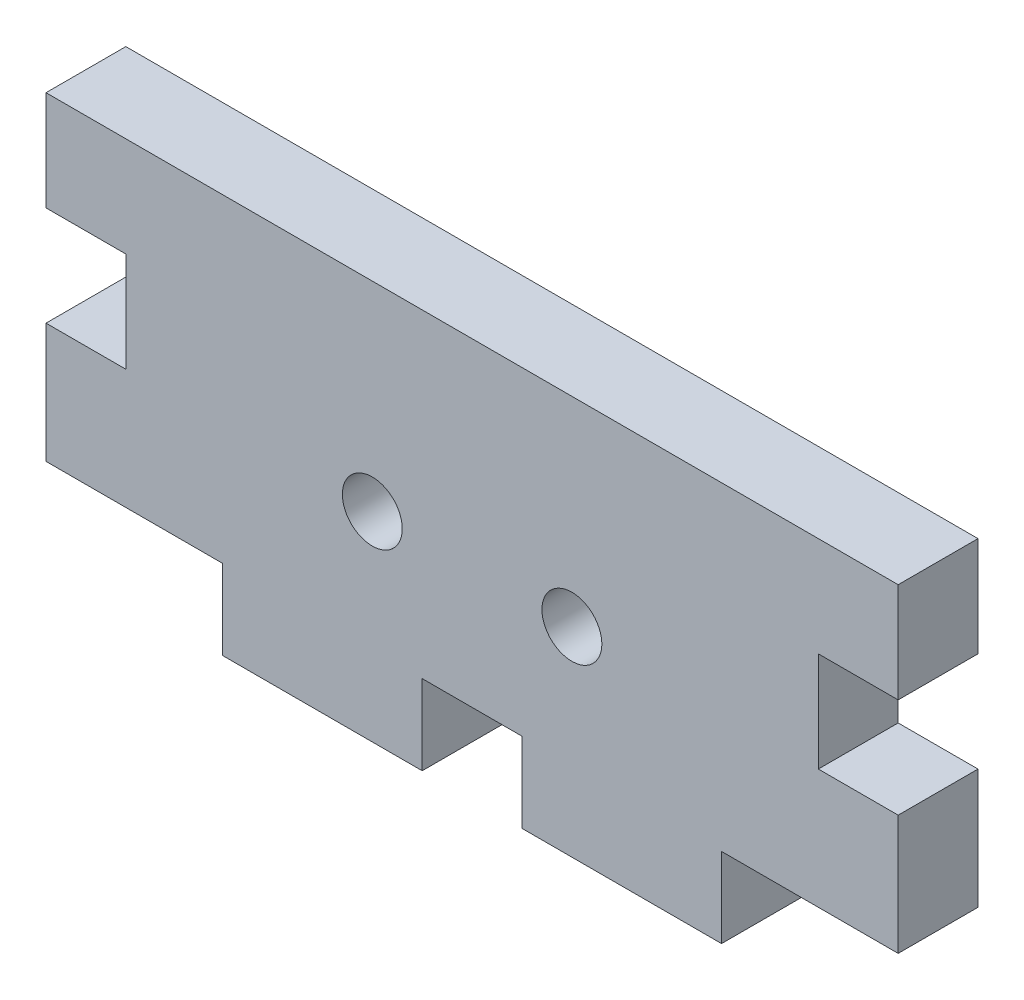
ISO-10303-21;
HEADER;
FILE_DESCRIPTION(('STEP AP214'),'2;1');
FILE_NAME('part.step','',(''),(''),'','','');
FILE_SCHEMA(('AUTOMOTIVE_DESIGN { 1 0 10303 214 1 1 1 1 }'));
ENDSEC;
DATA;
#1=APPLICATION_CONTEXT('core data for automotive mechanical design processes');
#2=APPLICATION_PROTOCOL_DEFINITION('international standard','automotive_design',2000,#1);
#3=PRODUCT_CONTEXT('',#1,'mechanical');
#4=PRODUCT('Part','Part','',(#3));
#5=PRODUCT_RELATED_PRODUCT_CATEGORY('part','',(#4));
#6=PRODUCT_DEFINITION_FORMATION('','',#4);
#7=PRODUCT_DEFINITION_CONTEXT('part definition',#1,'design');
#8=PRODUCT_DEFINITION('design','',#6,#7);
#9=PRODUCT_DEFINITION_SHAPE('','',#8);
#10=(LENGTH_UNIT() NAMED_UNIT(*) SI_UNIT(.MILLI.,.METRE.));
#11=(NAMED_UNIT(*) PLANE_ANGLE_UNIT() SI_UNIT($,.RADIAN.));
#12=(NAMED_UNIT(*) SI_UNIT($,.STERADIAN.) SOLID_ANGLE_UNIT());
#13=UNCERTAINTY_MEASURE_WITH_UNIT(LENGTH_MEASURE(1.E-05),#10,'distance_accuracy_value','');
#14=(GEOMETRIC_REPRESENTATION_CONTEXT(3) GLOBAL_UNCERTAINTY_ASSIGNED_CONTEXT((#13)) GLOBAL_UNIT_ASSIGNED_CONTEXT((#10,
#11,#12)) REPRESENTATION_CONTEXT('',''));
#15=CARTESIAN_POINT('',(0.,0.,0.));
#16=DIRECTION('',(0.,0.,1.));
#17=DIRECTION('',(1.,0.,0.));
#18=AXIS2_PLACEMENT_3D('',#15,#16,#17);
#19=CARTESIAN_POINT('',(0.,0.,4.));
#20=DIRECTION('',(1.,0.,0.));
#21=DIRECTION('',(0.,0.,-1.));
#22=AXIS2_PLACEMENT_3D('',#19,#20,#21);
#23=PLANE('',#22);
#24=DIRECTION('',(0.,-1.,0.));
#25=VECTOR('',#24,1.);
#26=CARTESIAN_POINT('',(0.,0.,0.));
#27=LINE('',#26,#25);
#28=CARTESIAN_POINT('',(0.,20.,0.));
#29=VERTEX_POINT('',#28);
#30=CARTESIAN_POINT('',(0.,15.,0.));
#31=VERTEX_POINT('',#30);
#32=EDGE_CURVE('E435',#29,#31,#27,.T.);
#33=ORIENTED_EDGE('',*,*,#32,.T.);
#34=DIRECTION('',(0.,0.,1.));
#35=VECTOR('',#34,1.);
#36=CARTESIAN_POINT('',(0.,15.,0.));
#37=LINE('',#36,#35);
#38=CARTESIAN_POINT('',(0.,15.,4.));
#39=VERTEX_POINT('',#38);
#40=EDGE_CURVE('E255',#31,#39,#37,.T.);
#41=ORIENTED_EDGE('',*,*,#40,.T.);
#42=DIRECTION('',(0.,-1.,0.));
#43=VECTOR('',#42,1.);
#44=CARTESIAN_POINT('',(0.,0.,4.));
#45=LINE('',#44,#43);
#46=CARTESIAN_POINT('',(0.,20.,4.));
#47=VERTEX_POINT('',#46);
#48=EDGE_CURVE('E285',#47,#39,#45,.T.);
#49=ORIENTED_EDGE('',*,*,#48,.F.);
#50=DIRECTION('',(0.,0.,-1.));
#51=VECTOR('',#50,1.);
#52=CARTESIAN_POINT('',(0.,20.,4.));
#53=LINE('',#52,#51);
#54=EDGE_CURVE('E51',#47,#29,#53,.T.);
#55=ORIENTED_EDGE('',*,*,#54,.T.);
#56=EDGE_LOOP('',(#33,#41,#49,#55));
#57=FACE_BOUND('',#56,.T.);
#58=ADVANCED_FACE('F42',(#57),#23,.F.);
#59=CARTESIAN_POINT('',(0.,0.,4.));
#60=DIRECTION('',(0.,1.,0.));
#61=DIRECTION('',(0.,0.,1.));
#62=AXIS2_PLACEMENT_3D('',#59,#60,#61);
#63=PLANE('',#62);
#64=DIRECTION('',(1.,0.,0.));
#65=VECTOR('',#64,1.);
#66=CARTESIAN_POINT('',(0.,0.,4.));
#67=LINE('',#66,#65);
#68=CARTESIAN_POINT('',(23.85,0.,4.));
#69=VERTEX_POINT('',#68);
#70=CARTESIAN_POINT('',(33.85,0.,4.));
#71=VERTEX_POINT('',#70);
#72=EDGE_CURVE('E270',#69,#71,#67,.T.);
#73=ORIENTED_EDGE('',*,*,#72,.F.);
#74=DIRECTION('',(0.,0.,1.));
#75=VECTOR('',#74,1.);
#76=CARTESIAN_POINT('',(23.85,0.,0.));
#77=LINE('',#76,#75);
#78=CARTESIAN_POINT('',(23.85,0.,0.));
#79=VERTEX_POINT('',#78);
#80=EDGE_CURVE('E237',#79,#69,#77,.T.);
#81=ORIENTED_EDGE('',*,*,#80,.F.);
#82=DIRECTION('',(1.,0.,0.));
#83=VECTOR('',#82,1.);
#84=CARTESIAN_POINT('',(0.,0.,0.));
#85=LINE('',#84,#83);
#86=CARTESIAN_POINT('',(33.85,0.,0.));
#87=VERTEX_POINT('',#86);
#88=EDGE_CURVE('E414',#79,#87,#85,.T.);
#89=ORIENTED_EDGE('',*,*,#88,.T.);
#90=DIRECTION('',(0.,0.,1.));
#91=VECTOR('',#90,1.);
#92=CARTESIAN_POINT('',(33.85,0.,0.));
#93=LINE('',#92,#91);
#94=EDGE_CURVE('E222',#87,#71,#93,.T.);
#95=ORIENTED_EDGE('',*,*,#94,.T.);
#96=EDGE_LOOP('',(#73,#81,#89,#95));
#97=FACE_BOUND('',#96,.T.);
#98=ADVANCED_FACE('F412',(#97),#63,.F.);
#99=CARTESIAN_POINT('',(42.7,0.,4.));
#100=DIRECTION('',(-1.,0.,0.));
#101=DIRECTION('',(0.,0.,1.));
#102=AXIS2_PLACEMENT_3D('',#99,#100,#101);
#103=PLANE('',#102);
#104=DIRECTION('',(0.,1.,0.));
#105=VECTOR('',#104,1.);
#106=CARTESIAN_POINT('',(42.7,0.,4.));
#107=LINE('',#106,#105);
#108=CARTESIAN_POINT('',(42.7,4.00000000000001,4.));
#109=VERTEX_POINT('',#108);
#110=CARTESIAN_POINT('',(42.7,10.,4.));
#111=VERTEX_POINT('',#110);
#112=EDGE_CURVE('E268',#109,#111,#107,.T.);
#113=ORIENTED_EDGE('',*,*,#112,.F.);
#114=DIRECTION('',(0.,0.,1.));
#115=VECTOR('',#114,1.);
#116=CARTESIAN_POINT('',(42.7,4.00000000000001,0.));
#117=LINE('',#116,#115);
#118=CARTESIAN_POINT('',(42.7,4.00000000000001,0.));
#119=VERTEX_POINT('',#118);
#120=EDGE_CURVE('E249',#119,#109,#117,.T.);
#121=ORIENTED_EDGE('',*,*,#120,.F.);
#122=DIRECTION('',(0.,1.,0.));
#123=VECTOR('',#122,1.);
#124=CARTESIAN_POINT('',(42.7,0.,0.));
#125=LINE('',#124,#123);
#126=CARTESIAN_POINT('',(42.7,10.,0.));
#127=VERTEX_POINT('',#126);
#128=EDGE_CURVE('E433',#119,#127,#125,.T.);
#129=ORIENTED_EDGE('',*,*,#128,.T.);
#130=DIRECTION('',(0.,0.,1.));
#131=VECTOR('',#130,1.);
#132=CARTESIAN_POINT('',(42.7,10.,0.));
#133=LINE('',#132,#131);
#134=EDGE_CURVE('E340',#127,#111,#133,.T.);
#135=ORIENTED_EDGE('',*,*,#134,.T.);
#136=EDGE_LOOP('',(#113,#121,#129,#135));
#137=FACE_BOUND('',#136,.T.);
#138=ADVANCED_FACE('F455',(#137),#103,.F.);
#139=CARTESIAN_POINT('',(0.,10.,4.));
#140=VERTEX_POINT('',#139);
#141=CARTESIAN_POINT('',(0.,4.,4.));
#142=VERTEX_POINT('',#141);
#143=EDGE_CURVE('E290',#140,#142,#45,.T.);
#144=ORIENTED_EDGE('',*,*,#143,.F.);
#145=DIRECTION('',(0.,0.,1.));
#146=VECTOR('',#145,1.);
#147=CARTESIAN_POINT('',(0.,10.,0.));
#148=LINE('',#147,#146);
#149=CARTESIAN_POINT('',(0.,10.,0.));
#150=VERTEX_POINT('',#149);
#151=EDGE_CURVE('E369',#150,#140,#148,.T.);
#152=ORIENTED_EDGE('',*,*,#151,.F.);
#153=CARTESIAN_POINT('',(0.,4.,0.));
#154=VERTEX_POINT('',#153);
#155=EDGE_CURVE('E311',#150,#154,#27,.T.);
#156=ORIENTED_EDGE('',*,*,#155,.T.);
#157=DIRECTION('',(0.,0.,1.));
#158=VECTOR('',#157,1.);
#159=CARTESIAN_POINT('',(0.,4.,0.));
#160=LINE('',#159,#158);
#161=EDGE_CURVE('E308',#154,#142,#160,.T.);
#162=ORIENTED_EDGE('',*,*,#161,.T.);
#163=EDGE_LOOP('',(#144,#152,#156,#162));
#164=FACE_BOUND('',#163,.T.);
#165=ADVANCED_FACE('F44',(#164),#23,.F.);
#166=CARTESIAN_POINT('',(8.85,0.,0.));
#167=VERTEX_POINT('',#166);
#168=CARTESIAN_POINT('',(18.85,0.,0.));
#169=VERTEX_POINT('',#168);
#170=EDGE_CURVE('E427',#167,#169,#85,.T.);
#171=ORIENTED_EDGE('',*,*,#170,.T.);
#172=DIRECTION('',(0.,0.,1.));
#173=VECTOR('',#172,1.);
#174=CARTESIAN_POINT('',(18.85,0.,0.));
#175=LINE('',#174,#173);
#176=CARTESIAN_POINT('',(18.85,0.,4.));
#177=VERTEX_POINT('',#176);
#178=EDGE_CURVE('E191',#169,#177,#175,.T.);
#179=ORIENTED_EDGE('',*,*,#178,.T.);
#180=CARTESIAN_POINT('',(8.85,0.,4.));
#181=VERTEX_POINT('',#180);
#182=EDGE_CURVE('E269',#181,#177,#67,.T.);
#183=ORIENTED_EDGE('',*,*,#182,.F.);
#184=DIRECTION('',(0.,0.,1.));
#185=VECTOR('',#184,1.);
#186=CARTESIAN_POINT('',(8.85,0.,0.));
#187=LINE('',#186,#185);
#188=EDGE_CURVE('E291',#167,#181,#187,.T.);
#189=ORIENTED_EDGE('',*,*,#188,.F.);
#190=EDGE_LOOP('',(#171,#179,#183,#189));
#191=FACE_BOUND('',#190,.T.);
#192=ADVANCED_FACE('F426',(#191),#63,.F.);
#193=CARTESIAN_POINT('',(42.7,15.,4.));
#194=VERTEX_POINT('',#193);
#195=CARTESIAN_POINT('',(42.7,20.,4.));
#196=VERTEX_POINT('',#195);
#197=EDGE_CURVE('E264',#194,#196,#107,.T.);
#198=ORIENTED_EDGE('',*,*,#197,.F.);
#199=DIRECTION('',(0.,0.,1.));
#200=VECTOR('',#199,1.);
#201=CARTESIAN_POINT('',(42.7,15.,0.));
#202=LINE('',#201,#200);
#203=CARTESIAN_POINT('',(42.7,15.,0.));
#204=VERTEX_POINT('',#203);
#205=EDGE_CURVE('E330',#204,#194,#202,.T.);
#206=ORIENTED_EDGE('',*,*,#205,.F.);
#207=CARTESIAN_POINT('',(42.7,20.,0.));
#208=VERTEX_POINT('',#207);
#209=EDGE_CURVE('E429',#204,#208,#125,.T.);
#210=ORIENTED_EDGE('',*,*,#209,.T.);
#211=DIRECTION('',(0.,0.,-1.));
#212=VECTOR('',#211,1.);
#213=CARTESIAN_POINT('',(42.7,20.,4.));
#214=LINE('',#213,#212);
#215=EDGE_CURVE('E12',#196,#208,#214,.T.);
#216=ORIENTED_EDGE('',*,*,#215,.F.);
#217=EDGE_LOOP('',(#198,#206,#210,#216));
#218=FACE_BOUND('',#217,.T.);
#219=ADVANCED_FACE('F472',(#218),#103,.F.);
#220=CARTESIAN_POINT('',(0.,20.,4.));
#221=DIRECTION('',(0.,-1.,0.));
#222=DIRECTION('',(0.,0.,-1.));
#223=AXIS2_PLACEMENT_3D('',#220,#221,#222);
#224=PLANE('',#223);
#225=DIRECTION('',(-1.,0.,0.));
#226=VECTOR('',#225,1.);
#227=CARTESIAN_POINT('',(0.,20.,0.));
#228=LINE('',#227,#226);
#229=EDGE_CURVE('E437',#208,#29,#228,.T.);
#230=ORIENTED_EDGE('',*,*,#229,.T.);
#231=ORIENTED_EDGE('',*,*,#54,.F.);
#232=DIRECTION('',(-1.,0.,0.));
#233=VECTOR('',#232,1.);
#234=CARTESIAN_POINT('',(0.,20.,4.));
#235=LINE('',#234,#233);
#236=EDGE_CURVE('E273',#196,#47,#235,.T.);
#237=ORIENTED_EDGE('',*,*,#236,.F.);
#238=ORIENTED_EDGE('',*,*,#215,.T.);
#239=EDGE_LOOP('',(#230,#231,#237,#238));
#240=FACE_BOUND('',#239,.T.);
#241=ADVANCED_FACE('F475',(#240),#224,.F.);
#242=CARTESIAN_POINT('',(0.,0.,4.));
#243=DIRECTION('',(0.,0.,-1.));
#244=DIRECTION('',(-1.,0.,0.));
#245=AXIS2_PLACEMENT_3D('',#242,#243,#244);
#246=PLANE('',#245);
#247=CARTESIAN_POINT('',(16.3499999999994,9.99999999999998,4.));
#248=DIRECTION('',(0.,0.,1.));
#249=DIRECTION('',(1.,0.,0.));
#250=AXIS2_PLACEMENT_3D('',#247,#248,#249);
#251=CIRCLE('',#250,1.5);
#252=CARTESIAN_POINT('',(17.8499999999994,9.99999999999998,4.));
#253=VERTEX_POINT('',#252);
#254=EDGE_CURVE('E658',#253,#253,#251,.T.);
#255=ORIENTED_EDGE('',*,*,#254,.F.);
#256=EDGE_LOOP('',(#255));
#257=FACE_BOUND('',#256,.T.);
#258=CARTESIAN_POINT('',(26.3500000000006,9.99999999999998,4.));
#259=DIRECTION('',(0.,0.,1.));
#260=DIRECTION('',(-1.,0.,0.));
#261=AXIS2_PLACEMENT_3D('',#258,#259,#260);
#262=CIRCLE('',#261,1.5);
#263=CARTESIAN_POINT('',(24.8500000000006,9.99999999999998,4.));
#264=VERTEX_POINT('',#263);
#265=EDGE_CURVE('E214',#264,#264,#262,.T.);
#266=ORIENTED_EDGE('',*,*,#265,.F.);
#267=EDGE_LOOP('',(#266));
#268=FACE_BOUND('',#267,.T.);
#269=DIRECTION('',(-1.,0.,0.));
#270=VECTOR('',#269,1.);
#271=CARTESIAN_POINT('',(18.85,4.,4.));
#272=LINE('',#271,#270);
#273=CARTESIAN_POINT('',(23.85,4.,4.));
#274=VERTEX_POINT('',#273);
#275=CARTESIAN_POINT('',(18.85,4.,4.));
#276=VERTEX_POINT('',#275);
#277=EDGE_CURVE('E187',#274,#276,#272,.T.);
#278=ORIENTED_EDGE('',*,*,#277,.F.);
#279=DIRECTION('',(0.,1.,0.));
#280=VECTOR('',#279,1.);
#281=CARTESIAN_POINT('',(23.85,0.,4.));
#282=LINE('',#281,#280);
#283=EDGE_CURVE('E207',#69,#274,#282,.T.);
#284=ORIENTED_EDGE('',*,*,#283,.F.);
#285=ORIENTED_EDGE('',*,*,#72,.T.);
#286=DIRECTION('',(0.,-1.,0.));
#287=VECTOR('',#286,1.);
#288=CARTESIAN_POINT('',(33.85,0.,4.));
#289=LINE('',#288,#287);
#290=CARTESIAN_POINT('',(33.85,4.,4.));
#291=VERTEX_POINT('',#290);
#292=EDGE_CURVE('E246',#291,#71,#289,.T.);
#293=ORIENTED_EDGE('',*,*,#292,.F.);
#294=DIRECTION('',(-1.,0.,0.));
#295=VECTOR('',#294,1.);
#296=CARTESIAN_POINT('',(42.7,4.00000000000001,4.));
#297=LINE('',#296,#295);
#298=EDGE_CURVE('E250',#109,#291,#297,.T.);
#299=ORIENTED_EDGE('',*,*,#298,.F.);
#300=ORIENTED_EDGE('',*,*,#112,.T.);
#301=DIRECTION('',(1.,0.,0.));
#302=VECTOR('',#301,1.);
#303=CARTESIAN_POINT('',(42.7,10.,4.));
#304=LINE('',#303,#302);
#305=CARTESIAN_POINT('',(38.7,10.,4.));
#306=VERTEX_POINT('',#305);
#307=EDGE_CURVE('E344',#306,#111,#304,.T.);
#308=ORIENTED_EDGE('',*,*,#307,.F.);
#309=DIRECTION('',(0.,-1.,0.));
#310=VECTOR('',#309,1.);
#311=CARTESIAN_POINT('',(38.7,15.,4.));
#312=LINE('',#311,#310);
#313=CARTESIAN_POINT('',(38.7,15.,4.));
#314=VERTEX_POINT('',#313);
#315=EDGE_CURVE('E349',#314,#306,#312,.T.);
#316=ORIENTED_EDGE('',*,*,#315,.F.);
#317=DIRECTION('',(-1.,0.,0.));
#318=VECTOR('',#317,1.);
#319=CARTESIAN_POINT('',(42.7,15.,4.));
#320=LINE('',#319,#318);
#321=EDGE_CURVE('E353',#194,#314,#320,.T.);
#322=ORIENTED_EDGE('',*,*,#321,.F.);
#323=ORIENTED_EDGE('',*,*,#197,.T.);
#324=ORIENTED_EDGE('',*,*,#236,.T.);
#325=ORIENTED_EDGE('',*,*,#48,.T.);
#326=DIRECTION('',(-1.,0.,0.));
#327=VECTOR('',#326,1.);
#328=CARTESIAN_POINT('',(0.,15.,4.));
#329=LINE('',#328,#327);
#330=CARTESIAN_POINT('',(4.,15.,4.));
#331=VERTEX_POINT('',#330);
#332=EDGE_CURVE('E381',#331,#39,#329,.T.);
#333=ORIENTED_EDGE('',*,*,#332,.F.);
#334=DIRECTION('',(0.,1.,0.));
#335=VECTOR('',#334,1.);
#336=CARTESIAN_POINT('',(4.,15.,4.));
#337=LINE('',#336,#335);
#338=CARTESIAN_POINT('',(4.,10.,4.));
#339=VERTEX_POINT('',#338);
#340=EDGE_CURVE('E386',#339,#331,#337,.T.);
#341=ORIENTED_EDGE('',*,*,#340,.F.);
#342=DIRECTION('',(1.,0.,0.));
#343=VECTOR('',#342,1.);
#344=CARTESIAN_POINT('',(0.,10.,4.));
#345=LINE('',#344,#343);
#346=EDGE_CURVE('E343',#140,#339,#345,.T.);
#347=ORIENTED_EDGE('',*,*,#346,.F.);
#348=ORIENTED_EDGE('',*,*,#143,.T.);
#349=DIRECTION('',(-1.,0.,0.));
#350=VECTOR('',#349,1.);
#351=CARTESIAN_POINT('',(0.,4.,4.));
#352=LINE('',#351,#350);
#353=CARTESIAN_POINT('',(8.85,4.,4.));
#354=VERTEX_POINT('',#353);
#355=EDGE_CURVE('E301',#354,#142,#352,.T.);
#356=ORIENTED_EDGE('',*,*,#355,.F.);
#357=DIRECTION('',(0.,1.,0.));
#358=VECTOR('',#357,1.);
#359=CARTESIAN_POINT('',(8.85,0.,4.));
#360=LINE('',#359,#358);
#361=EDGE_CURVE('E236',#181,#354,#360,.T.);
#362=ORIENTED_EDGE('',*,*,#361,.F.);
#363=ORIENTED_EDGE('',*,*,#182,.T.);
#364=DIRECTION('',(0.,-1.,0.));
#365=VECTOR('',#364,1.);
#366=CARTESIAN_POINT('',(18.85,0.,4.));
#367=LINE('',#366,#365);
#368=EDGE_CURVE('E211',#276,#177,#367,.T.);
#369=ORIENTED_EDGE('',*,*,#368,.F.);
#370=EDGE_LOOP('',(#278,#284,#285,#293,#299,#300,#308,#316,#322,#323,#324,#325,#333,#341,#347,
#348,#356,#362,#363,#369));
#371=FACE_BOUND('',#370,.T.);
#372=ADVANCED_FACE('F418',(#257,#268,#371),#246,.F.);
#373=CARTESIAN_POINT('',(0.,0.,0.));
#374=DIRECTION('',(0.,0.,-1.));
#375=DIRECTION('',(-1.,0.,0.));
#376=AXIS2_PLACEMENT_3D('',#373,#374,#375);
#377=PLANE('',#376);
#378=DIRECTION('',(0.,1.,0.));
#379=VECTOR('',#378,1.);
#380=CARTESIAN_POINT('',(23.85,0.,0.));
#381=LINE('',#380,#379);
#382=CARTESIAN_POINT('',(23.85,4.,0.));
#383=VERTEX_POINT('',#382);
#384=EDGE_CURVE('E192',#79,#383,#381,.T.);
#385=ORIENTED_EDGE('',*,*,#384,.T.);
#386=DIRECTION('',(-1.,0.,0.));
#387=VECTOR('',#386,1.);
#388=CARTESIAN_POINT('',(18.85,4.,0.));
#389=LINE('',#388,#387);
#390=CARTESIAN_POINT('',(18.85,4.,0.));
#391=VERTEX_POINT('',#390);
#392=EDGE_CURVE('E184',#383,#391,#389,.T.);
#393=ORIENTED_EDGE('',*,*,#392,.T.);
#394=DIRECTION('',(0.,-1.,0.));
#395=VECTOR('',#394,1.);
#396=CARTESIAN_POINT('',(18.85,0.,0.));
#397=LINE('',#396,#395);
#398=EDGE_CURVE('E195',#391,#169,#397,.T.);
#399=ORIENTED_EDGE('',*,*,#398,.T.);
#400=ORIENTED_EDGE('',*,*,#170,.F.);
#401=DIRECTION('',(0.,1.,0.));
#402=VECTOR('',#401,1.);
#403=CARTESIAN_POINT('',(8.85,0.,0.));
#404=LINE('',#403,#402);
#405=CARTESIAN_POINT('',(8.85,4.,0.));
#406=VERTEX_POINT('',#405);
#407=EDGE_CURVE('E305',#167,#406,#404,.T.);
#408=ORIENTED_EDGE('',*,*,#407,.T.);
#409=DIRECTION('',(-1.,0.,0.));
#410=VECTOR('',#409,1.);
#411=CARTESIAN_POINT('',(0.,4.,0.));
#412=LINE('',#411,#410);
#413=EDGE_CURVE('E318',#406,#154,#412,.T.);
#414=ORIENTED_EDGE('',*,*,#413,.T.);
#415=ORIENTED_EDGE('',*,*,#155,.F.);
#416=DIRECTION('',(1.,0.,0.));
#417=VECTOR('',#416,1.);
#418=CARTESIAN_POINT('',(0.,10.,0.));
#419=LINE('',#418,#417);
#420=CARTESIAN_POINT('',(4.,10.,0.));
#421=VERTEX_POINT('',#420);
#422=EDGE_CURVE('E385',#150,#421,#419,.T.);
#423=ORIENTED_EDGE('',*,*,#422,.T.);
#424=DIRECTION('',(0.,1.,0.));
#425=VECTOR('',#424,1.);
#426=CARTESIAN_POINT('',(4.,15.,0.));
#427=LINE('',#426,#425);
#428=CARTESIAN_POINT('',(4.,15.,0.));
#429=VERTEX_POINT('',#428);
#430=EDGE_CURVE('E66',#421,#429,#427,.T.);
#431=ORIENTED_EDGE('',*,*,#430,.T.);
#432=DIRECTION('',(-1.,0.,0.));
#433=VECTOR('',#432,1.);
#434=CARTESIAN_POINT('',(0.,15.,0.));
#435=LINE('',#434,#433);
#436=EDGE_CURVE('E373',#429,#31,#435,.T.);
#437=ORIENTED_EDGE('',*,*,#436,.T.);
#438=ORIENTED_EDGE('',*,*,#32,.F.);
#439=ORIENTED_EDGE('',*,*,#229,.F.);
#440=ORIENTED_EDGE('',*,*,#209,.F.);
#441=DIRECTION('',(-1.,0.,0.));
#442=VECTOR('',#441,1.);
#443=CARTESIAN_POINT('',(42.7,15.,0.));
#444=LINE('',#443,#442);
#445=CARTESIAN_POINT('',(38.7,15.,0.));
#446=VERTEX_POINT('',#445);
#447=EDGE_CURVE('E348',#204,#446,#444,.T.);
#448=ORIENTED_EDGE('',*,*,#447,.T.);
#449=DIRECTION('',(0.,-1.,0.));
#450=VECTOR('',#449,1.);
#451=CARTESIAN_POINT('',(38.7,15.,0.));
#452=LINE('',#451,#450);
#453=CARTESIAN_POINT('',(38.7,10.,0.));
#454=VERTEX_POINT('',#453);
#455=EDGE_CURVE('E362',#446,#454,#452,.T.);
#456=ORIENTED_EDGE('',*,*,#455,.T.);
#457=DIRECTION('',(1.,0.,0.));
#458=VECTOR('',#457,1.);
#459=CARTESIAN_POINT('',(42.7,10.,0.));
#460=LINE('',#459,#458);
#461=EDGE_CURVE('E334',#454,#127,#460,.T.);
#462=ORIENTED_EDGE('',*,*,#461,.T.);
#463=ORIENTED_EDGE('',*,*,#128,.F.);
#464=DIRECTION('',(-1.,0.,0.));
#465=VECTOR('',#464,1.);
#466=CARTESIAN_POINT('',(42.7,4.00000000000001,0.));
#467=LINE('',#466,#465);
#468=CARTESIAN_POINT('',(33.85,4.,0.));
#469=VERTEX_POINT('',#468);
#470=EDGE_CURVE('E242',#119,#469,#467,.T.);
#471=ORIENTED_EDGE('',*,*,#470,.T.);
#472=DIRECTION('',(0.,-1.,0.));
#473=VECTOR('',#472,1.);
#474=CARTESIAN_POINT('',(33.85,0.,0.));
#475=LINE('',#474,#473);
#476=EDGE_CURVE('E58',#469,#87,#475,.T.);
#477=ORIENTED_EDGE('',*,*,#476,.T.);
#478=ORIENTED_EDGE('',*,*,#88,.F.);
#479=EDGE_LOOP('',(#385,#393,#399,#400,#408,#414,#415,#423,#431,#437,#438,#439,#440,#448,#456,
#462,#463,#471,#477,#478));
#480=FACE_BOUND('',#479,.T.);
#481=CARTESIAN_POINT('',(16.3499999999994,9.99999999999998,0.));
#482=DIRECTION('',(0.,0.,1.));
#483=DIRECTION('',(1.,0.,0.));
#484=AXIS2_PLACEMENT_3D('',#481,#482,#483);
#485=CIRCLE('',#484,1.5);
#486=CARTESIAN_POINT('',(17.8499999999994,9.99999999999998,0.));
#487=VERTEX_POINT('',#486);
#488=EDGE_CURVE('E358',#487,#487,#485,.T.);
#489=ORIENTED_EDGE('',*,*,#488,.T.);
#490=EDGE_LOOP('',(#489));
#491=FACE_BOUND('',#490,.T.);
#492=CARTESIAN_POINT('',(26.3500000000006,9.99999999999998,0.));
#493=DIRECTION('',(0.,0.,1.));
#494=DIRECTION('',(-1.,0.,0.));
#495=AXIS2_PLACEMENT_3D('',#492,#493,#494);
#496=CIRCLE('',#495,1.5);
#497=CARTESIAN_POINT('',(24.8500000000006,9.99999999999998,0.));
#498=VERTEX_POINT('',#497);
#499=EDGE_CURVE('E662',#498,#498,#496,.T.);
#500=ORIENTED_EDGE('',*,*,#499,.T.);
#501=EDGE_LOOP('',(#500));
#502=FACE_BOUND('',#501,.T.);
#503=ADVANCED_FACE('F203',(#480,#491,#502),#377,.T.);
#504=CARTESIAN_POINT('',(0.,4.,0.));
#505=DIRECTION('',(0.,1.,0.));
#506=DIRECTION('',(0.,0.,1.));
#507=AXIS2_PLACEMENT_3D('',#504,#505,#506);
#508=PLANE('',#507);
#509=ORIENTED_EDGE('',*,*,#355,.T.);
#510=ORIENTED_EDGE('',*,*,#161,.F.);
#511=ORIENTED_EDGE('',*,*,#413,.F.);
#512=DIRECTION('',(0.,0.,1.));
#513=VECTOR('',#512,1.);
#514=CARTESIAN_POINT('',(8.85,4.,0.));
#515=LINE('',#514,#513);
#516=EDGE_CURVE('E312',#406,#354,#515,.T.);
#517=ORIENTED_EDGE('',*,*,#516,.T.);
#518=EDGE_LOOP('',(#509,#510,#511,#517));
#519=FACE_BOUND('',#518,.T.);
#520=ADVANCED_FACE('F491',(#519),#508,.F.);
#521=CARTESIAN_POINT('',(8.85,0.,0.));
#522=DIRECTION('',(1.,0.,0.));
#523=DIRECTION('',(0.,0.,-1.));
#524=AXIS2_PLACEMENT_3D('',#521,#522,#523);
#525=PLANE('',#524);
#526=ORIENTED_EDGE('',*,*,#361,.T.);
#527=ORIENTED_EDGE('',*,*,#516,.F.);
#528=ORIENTED_EDGE('',*,*,#407,.F.);
#529=ORIENTED_EDGE('',*,*,#188,.T.);
#530=EDGE_LOOP('',(#526,#527,#528,#529));
#531=FACE_BOUND('',#530,.T.);
#532=ADVANCED_FACE('F492',(#531),#525,.F.);
#533=CARTESIAN_POINT('',(26.3500000000006,9.99999999999998,0.));
#534=DIRECTION('',(0.,0.,1.));
#535=DIRECTION('',(1.,0.,0.));
#536=AXIS2_PLACEMENT_3D('',#533,#534,#535);
#537=CYLINDRICAL_SURFACE('',#536,1.5);
#538=ORIENTED_EDGE('',*,*,#499,.F.);
#539=EDGE_LOOP('',(#538));
#540=FACE_BOUND('',#539,.T.);
#541=ORIENTED_EDGE('',*,*,#265,.T.);
#542=EDGE_LOOP('',(#541));
#543=FACE_BOUND('',#542,.T.);
#544=ADVANCED_FACE('F495',(#540,#543),#537,.F.);
#545=CARTESIAN_POINT('',(16.3499999999994,9.99999999999998,0.));
#546=DIRECTION('',(0.,0.,1.));
#547=DIRECTION('',(1.,0.,0.));
#548=AXIS2_PLACEMENT_3D('',#545,#546,#547);
#549=CYLINDRICAL_SURFACE('',#548,1.5);
#550=ORIENTED_EDGE('',*,*,#488,.F.);
#551=EDGE_LOOP('',(#550));
#552=FACE_BOUND('',#551,.T.);
#553=ORIENTED_EDGE('',*,*,#254,.T.);
#554=EDGE_LOOP('',(#553));
#555=FACE_BOUND('',#554,.T.);
#556=ADVANCED_FACE('F501',(#552,#555),#549,.F.);
#557=CARTESIAN_POINT('',(42.7,10.,0.));
#558=DIRECTION('',(0.,-1.,0.));
#559=DIRECTION('',(1.,0.,0.));
#560=AXIS2_PLACEMENT_3D('',#557,#558,#559);
#561=PLANE('',#560);
#562=ORIENTED_EDGE('',*,*,#307,.T.);
#563=ORIENTED_EDGE('',*,*,#134,.F.);
#564=ORIENTED_EDGE('',*,*,#461,.F.);
#565=DIRECTION('',(0.,0.,1.));
#566=VECTOR('',#565,1.);
#567=CARTESIAN_POINT('',(38.7,10.,0.));
#568=LINE('',#567,#566);
#569=EDGE_CURVE('E337',#454,#306,#568,.T.);
#570=ORIENTED_EDGE('',*,*,#569,.T.);
#571=EDGE_LOOP('',(#562,#563,#564,#570));
#572=FACE_BOUND('',#571,.T.);
#573=ADVANCED_FACE('F460',(#572),#561,.F.);
#574=CARTESIAN_POINT('',(38.7,15.,0.));
#575=DIRECTION('',(-1.,0.,0.));
#576=DIRECTION('',(0.,0.,1.));
#577=AXIS2_PLACEMENT_3D('',#574,#575,#576);
#578=PLANE('',#577);
#579=ORIENTED_EDGE('',*,*,#315,.T.);
#580=ORIENTED_EDGE('',*,*,#569,.F.);
#581=ORIENTED_EDGE('',*,*,#455,.F.);
#582=DIRECTION('',(0.,0.,1.));
#583=VECTOR('',#582,1.);
#584=CARTESIAN_POINT('',(38.7,15.,0.));
#585=LINE('',#584,#583);
#586=EDGE_CURVE('E333',#446,#314,#585,.T.);
#587=ORIENTED_EDGE('',*,*,#586,.T.);
#588=EDGE_LOOP('',(#579,#580,#581,#587));
#589=FACE_BOUND('',#588,.T.);
#590=ADVANCED_FACE('F464',(#589),#578,.F.);
#591=CARTESIAN_POINT('',(42.7,15.,0.));
#592=DIRECTION('',(0.,1.,0.));
#593=DIRECTION('',(-1.,0.,0.));
#594=AXIS2_PLACEMENT_3D('',#591,#592,#593);
#595=PLANE('',#594);
#596=ORIENTED_EDGE('',*,*,#321,.T.);
#597=ORIENTED_EDGE('',*,*,#586,.F.);
#598=ORIENTED_EDGE('',*,*,#447,.F.);
#599=ORIENTED_EDGE('',*,*,#205,.T.);
#600=EDGE_LOOP('',(#596,#597,#598,#599));
#601=FACE_BOUND('',#600,.T.);
#602=ADVANCED_FACE('F466',(#601),#595,.F.);
#603=CARTESIAN_POINT('',(0.,15.,0.));
#604=DIRECTION('',(0.,1.,0.));
#605=DIRECTION('',(0.,0.,1.));
#606=AXIS2_PLACEMENT_3D('',#603,#604,#605);
#607=PLANE('',#606);
#608=ORIENTED_EDGE('',*,*,#332,.T.);
#609=ORIENTED_EDGE('',*,*,#40,.F.);
#610=ORIENTED_EDGE('',*,*,#436,.F.);
#611=DIRECTION('',(0.,0.,1.));
#612=VECTOR('',#611,1.);
#613=CARTESIAN_POINT('',(4.,15.,0.));
#614=LINE('',#613,#612);
#615=EDGE_CURVE('E376',#429,#331,#614,.T.);
#616=ORIENTED_EDGE('',*,*,#615,.T.);
#617=EDGE_LOOP('',(#608,#609,#610,#616));
#618=FACE_BOUND('',#617,.T.);
#619=ADVANCED_FACE('F480',(#618),#607,.F.);
#620=CARTESIAN_POINT('',(4.,15.,0.));
#621=DIRECTION('',(1.,0.,0.));
#622=DIRECTION('',(0.,1.,0.));
#623=AXIS2_PLACEMENT_3D('',#620,#621,#622);
#624=PLANE('',#623);
#625=ORIENTED_EDGE('',*,*,#340,.T.);
#626=ORIENTED_EDGE('',*,*,#615,.F.);
#627=ORIENTED_EDGE('',*,*,#430,.F.);
#628=DIRECTION('',(0.,0.,1.));
#629=VECTOR('',#628,1.);
#630=CARTESIAN_POINT('',(4.,10.,0.));
#631=LINE('',#630,#629);
#632=EDGE_CURVE('E372',#421,#339,#631,.T.);
#633=ORIENTED_EDGE('',*,*,#632,.T.);
#634=EDGE_LOOP('',(#625,#626,#627,#633));
#635=FACE_BOUND('',#634,.T.);
#636=ADVANCED_FACE('F482',(#635),#624,.F.);
#637=CARTESIAN_POINT('',(0.,10.,0.));
#638=DIRECTION('',(0.,-1.,0.));
#639=DIRECTION('',(0.,0.,-1.));
#640=AXIS2_PLACEMENT_3D('',#637,#638,#639);
#641=PLANE('',#640);
#642=ORIENTED_EDGE('',*,*,#346,.T.);
#643=ORIENTED_EDGE('',*,*,#632,.F.);
#644=ORIENTED_EDGE('',*,*,#422,.F.);
#645=ORIENTED_EDGE('',*,*,#151,.T.);
#646=EDGE_LOOP('',(#642,#643,#644,#645));
#647=FACE_BOUND('',#646,.T.);
#648=ADVANCED_FACE('F484',(#647),#641,.F.);
#649=CARTESIAN_POINT('',(33.85,0.,0.));
#650=DIRECTION('',(-1.,0.,0.));
#651=DIRECTION('',(0.,0.,1.));
#652=AXIS2_PLACEMENT_3D('',#649,#650,#651);
#653=PLANE('',#652);
#654=ORIENTED_EDGE('',*,*,#292,.T.);
#655=ORIENTED_EDGE('',*,*,#94,.F.);
#656=ORIENTED_EDGE('',*,*,#476,.F.);
#657=DIRECTION('',(0.,0.,1.));
#658=VECTOR('',#657,1.);
#659=CARTESIAN_POINT('',(33.85,4.,0.));
#660=LINE('',#659,#658);
#661=EDGE_CURVE('E404',#469,#291,#660,.T.);
#662=ORIENTED_EDGE('',*,*,#661,.T.);
#663=EDGE_LOOP('',(#654,#655,#656,#662));
#664=FACE_BOUND('',#663,.T.);
#665=ADVANCED_FACE('F606',(#664),#653,.F.);
#666=CARTESIAN_POINT('',(42.7,4.00000000000001,0.));
#667=DIRECTION('',(0.,1.,0.));
#668=DIRECTION('',(-1.,0.,0.));
#669=AXIS2_PLACEMENT_3D('',#666,#667,#668);
#670=PLANE('',#669);
#671=ORIENTED_EDGE('',*,*,#298,.T.);
#672=ORIENTED_EDGE('',*,*,#661,.F.);
#673=ORIENTED_EDGE('',*,*,#470,.F.);
#674=ORIENTED_EDGE('',*,*,#120,.T.);
#675=EDGE_LOOP('',(#671,#672,#673,#674));
#676=FACE_BOUND('',#675,.T.);
#677=ADVANCED_FACE('F615',(#676),#670,.F.);
#678=CARTESIAN_POINT('',(18.85,4.,0.));
#679=DIRECTION('',(0.,1.,0.));
#680=DIRECTION('',(0.,0.,1.));
#681=AXIS2_PLACEMENT_3D('',#678,#679,#680);
#682=PLANE('',#681);
#683=ORIENTED_EDGE('',*,*,#277,.T.);
#684=DIRECTION('',(0.,0.,1.));
#685=VECTOR('',#684,1.);
#686=CARTESIAN_POINT('',(18.85,4.,0.));
#687=LINE('',#686,#685);
#688=EDGE_CURVE('E180',#391,#276,#687,.T.);
#689=ORIENTED_EDGE('',*,*,#688,.F.);
#690=ORIENTED_EDGE('',*,*,#392,.F.);
#691=DIRECTION('',(0.,0.,1.));
#692=VECTOR('',#691,1.);
#693=CARTESIAN_POINT('',(23.85,4.,0.));
#694=LINE('',#693,#692);
#695=EDGE_CURVE('E233',#383,#274,#694,.T.);
#696=ORIENTED_EDGE('',*,*,#695,.T.);
#697=EDGE_LOOP('',(#683,#689,#690,#696));
#698=FACE_BOUND('',#697,.T.);
#699=ADVANCED_FACE('F182',(#698),#682,.F.);
#700=CARTESIAN_POINT('',(23.85,0.,0.));
#701=DIRECTION('',(1.,0.,0.));
#702=DIRECTION('',(0.,1.,0.));
#703=AXIS2_PLACEMENT_3D('',#700,#701,#702);
#704=PLANE('',#703);
#705=ORIENTED_EDGE('',*,*,#283,.T.);
#706=ORIENTED_EDGE('',*,*,#695,.F.);
#707=ORIENTED_EDGE('',*,*,#384,.F.);
#708=ORIENTED_EDGE('',*,*,#80,.T.);
#709=EDGE_LOOP('',(#705,#706,#707,#708));
#710=FACE_BOUND('',#709,.T.);
#711=ADVANCED_FACE('F633',(#710),#704,.F.);
#712=CARTESIAN_POINT('',(18.85,0.,0.));
#713=DIRECTION('',(-1.,0.,0.));
#714=DIRECTION('',(0.,0.,1.));
#715=AXIS2_PLACEMENT_3D('',#712,#713,#714);
#716=PLANE('',#715);
#717=ORIENTED_EDGE('',*,*,#368,.T.);
#718=ORIENTED_EDGE('',*,*,#178,.F.);
#719=ORIENTED_EDGE('',*,*,#398,.F.);
#720=ORIENTED_EDGE('',*,*,#688,.T.);
#721=EDGE_LOOP('',(#717,#718,#719,#720));
#722=FACE_BOUND('',#721,.T.);
#723=ADVANCED_FACE('F196',(#722),#716,.F.);
#724=CLOSED_SHELL('',(#58,#98,#138,#165,#192,#219,#241,#372,#503,#520,#532,#544,#556,#573,#590,
#602,#619,#636,#648,#665,#677,#699,#711,#723));
#725=MANIFOLD_SOLID_BREP('B2',#724);
#726=ADVANCED_BREP_SHAPE_REPRESENTATION('',(#18,#725),#14);
#727=SHAPE_DEFINITION_REPRESENTATION(#9,#726);
ENDSEC;
END-ISO-10303-21;
